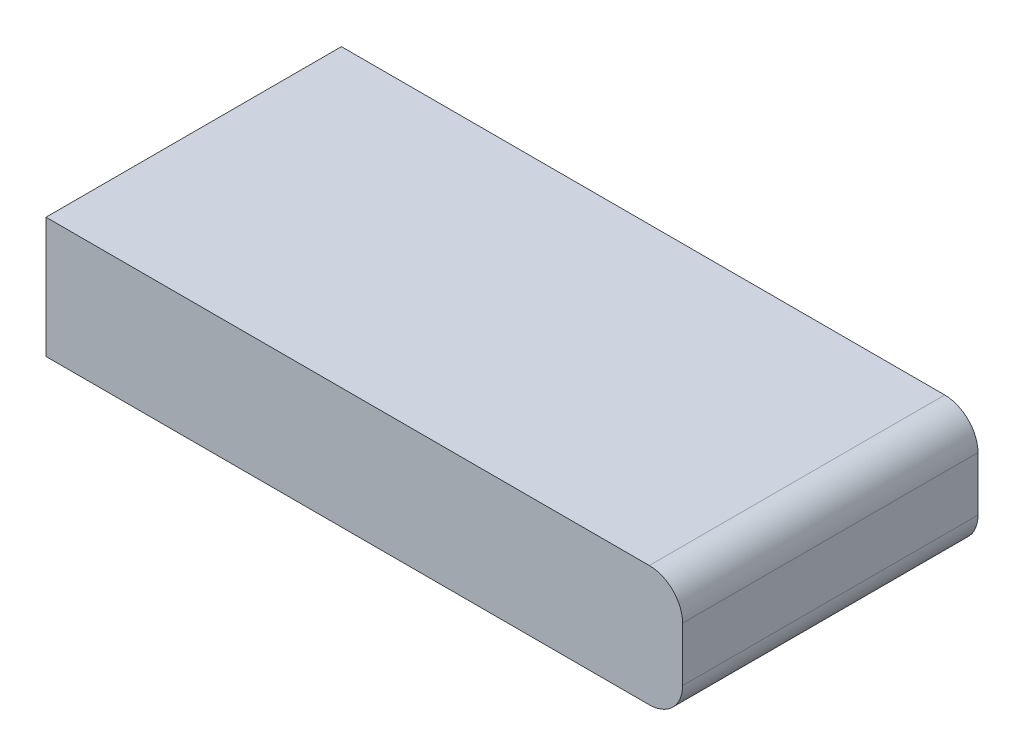
ISO-10303-21;
HEADER;
FILE_DESCRIPTION(('STEP AP214'),'2;1');
FILE_NAME('part.step','',(''),(''),'','','');
FILE_SCHEMA(('AUTOMOTIVE_DESIGN { 1 0 10303 214 1 1 1 1 }'));
ENDSEC;
DATA;
#1=APPLICATION_CONTEXT('core data for automotive mechanical design processes');
#2=APPLICATION_PROTOCOL_DEFINITION('international standard','automotive_design',2000,#1);
#3=PRODUCT_CONTEXT('',#1,'mechanical');
#4=PRODUCT('Part','Part','',(#3));
#5=PRODUCT_RELATED_PRODUCT_CATEGORY('part','',(#4));
#6=PRODUCT_DEFINITION_FORMATION('','',#4);
#7=PRODUCT_DEFINITION_CONTEXT('part definition',#1,'design');
#8=PRODUCT_DEFINITION('design','',#6,#7);
#9=PRODUCT_DEFINITION_SHAPE('','',#8);
#10=(LENGTH_UNIT() NAMED_UNIT(*) SI_UNIT(.MILLI.,.METRE.));
#11=(NAMED_UNIT(*) PLANE_ANGLE_UNIT() SI_UNIT($,.RADIAN.));
#12=(NAMED_UNIT(*) SI_UNIT($,.STERADIAN.) SOLID_ANGLE_UNIT());
#13=UNCERTAINTY_MEASURE_WITH_UNIT(LENGTH_MEASURE(1.E-05),#10,'distance_accuracy_value','');
#14=(GEOMETRIC_REPRESENTATION_CONTEXT(3) GLOBAL_UNCERTAINTY_ASSIGNED_CONTEXT((#13)) GLOBAL_UNIT_ASSIGNED_CONTEXT((#10,
#11,#12)) REPRESENTATION_CONTEXT('',''));
#15=CARTESIAN_POINT('',(0.,0.,0.));
#16=DIRECTION('',(0.,0.,1.));
#17=DIRECTION('',(1.,0.,0.));
#18=AXIS2_PLACEMENT_3D('',#15,#16,#17);
#19=CARTESIAN_POINT('',(68.5,8.,0.));
#20=DIRECTION('',(0.,0.,1.));
#21=DIRECTION('',(1.,0.,0.));
#22=AXIS2_PLACEMENT_3D('',#19,#20,#21);
#23=CYLINDRICAL_SURFACE('',#22,8.);
#24=DIRECTION('',(0.,0.,1.));
#25=VECTOR('',#24,1.);
#26=CARTESIAN_POINT('',(68.5,0.,0.));
#27=LINE('',#26,#25);
#28=CARTESIAN_POINT('',(68.5,0.,-35.5));
#29=VERTEX_POINT('',#28);
#30=CARTESIAN_POINT('',(68.5,0.,35.5));
#31=VERTEX_POINT('',#30);
#32=EDGE_CURVE('E138',#29,#31,#27,.T.);
#33=ORIENTED_EDGE('',*,*,#32,.F.);
#34=CARTESIAN_POINT('',(68.5,8.,-35.5));
#35=DIRECTION('',(0.,0.,1.));
#36=DIRECTION('',(1.,0.,0.));
#37=AXIS2_PLACEMENT_3D('',#34,#35,#36);
#38=CIRCLE('',#37,8.);
#39=CARTESIAN_POINT('',(76.5,8.00000000000001,-35.5));
#40=VERTEX_POINT('',#39);
#41=EDGE_CURVE('E57',#40,#29,#38,.F.);
#42=ORIENTED_EDGE('',*,*,#41,.F.);
#43=DIRECTION('',(0.,0.,1.));
#44=VECTOR('',#43,1.);
#45=CARTESIAN_POINT('',(76.5,8.,35.5));
#46=LINE('',#45,#44);
#47=CARTESIAN_POINT('',(76.5,8.00000000000001,35.5));
#48=VERTEX_POINT('',#47);
#49=EDGE_CURVE('E141',#48,#40,#46,.F.);
#50=ORIENTED_EDGE('',*,*,#49,.F.);
#51=CARTESIAN_POINT('',(68.5,8.,35.5));
#52=DIRECTION('',(0.,0.,-1.));
#53=DIRECTION('',(-1.,0.,0.));
#54=AXIS2_PLACEMENT_3D('',#51,#52,#53);
#55=CIRCLE('',#54,8.);
#56=EDGE_CURVE('E13',#31,#48,#55,.F.);
#57=ORIENTED_EDGE('',*,*,#56,.F.);
#58=EDGE_LOOP('',(#33,#42,#50,#57));
#59=FACE_BOUND('',#58,.T.);
#60=ADVANCED_FACE('F50',(#59),#23,.T.);
#61=CARTESIAN_POINT('',(68.5,21.,35.5));
#62=DIRECTION('',(0.,0.,-1.));
#63=DIRECTION('',(-1.,0.,0.));
#64=AXIS2_PLACEMENT_3D('',#61,#62,#63);
#65=CYLINDRICAL_SURFACE('',#64,8.);
#66=DIRECTION('',(0.,0.,1.));
#67=VECTOR('',#66,1.);
#68=CARTESIAN_POINT('',(76.5,21.,35.5));
#69=LINE('',#68,#67);
#70=CARTESIAN_POINT('',(76.5,21.,-35.5));
#71=VERTEX_POINT('',#70);
#72=CARTESIAN_POINT('',(76.5,21.,35.5));
#73=VERTEX_POINT('',#72);
#74=EDGE_CURVE('E123',#71,#73,#69,.T.);
#75=ORIENTED_EDGE('',*,*,#74,.F.);
#76=CARTESIAN_POINT('',(68.5,21.,-35.5));
#77=DIRECTION('',(0.,0.,1.));
#78=DIRECTION('',(1.,0.,0.));
#79=AXIS2_PLACEMENT_3D('',#76,#77,#78);
#80=CIRCLE('',#79,8.);
#81=CARTESIAN_POINT('',(68.5,29.,-35.5));
#82=VERTEX_POINT('',#81);
#83=EDGE_CURVE('E135',#82,#71,#80,.F.);
#84=ORIENTED_EDGE('',*,*,#83,.F.);
#85=DIRECTION('',(0.,0.,1.));
#86=VECTOR('',#85,1.);
#87=CARTESIAN_POINT('',(68.5,29.,35.5));
#88=LINE('',#87,#86);
#89=CARTESIAN_POINT('',(68.5,29.,35.5));
#90=VERTEX_POINT('',#89);
#91=EDGE_CURVE('E127',#90,#82,#88,.F.);
#92=ORIENTED_EDGE('',*,*,#91,.F.);
#93=CARTESIAN_POINT('',(68.5,21.,35.5));
#94=DIRECTION('',(0.,0.,-1.));
#95=DIRECTION('',(-1.,0.,0.));
#96=AXIS2_PLACEMENT_3D('',#93,#94,#95);
#97=CIRCLE('',#96,8.);
#98=EDGE_CURVE('E105',#73,#90,#97,.F.);
#99=ORIENTED_EDGE('',*,*,#98,.F.);
#100=EDGE_LOOP('',(#75,#84,#92,#99));
#101=FACE_BOUND('',#100,.T.);
#102=ADVANCED_FACE('F158',(#101),#65,.T.);
#103=CARTESIAN_POINT('',(-76.5,29.,35.5));
#104=DIRECTION('',(1.,0.,0.));
#105=DIRECTION('',(0.,0.,-1.));
#106=AXIS2_PLACEMENT_3D('',#103,#104,#105);
#107=PLANE('',#106);
#108=DIRECTION('',(0.,0.,1.));
#109=VECTOR('',#108,1.);
#110=CARTESIAN_POINT('',(-76.5,0.,35.5));
#111=LINE('',#110,#109);
#112=CARTESIAN_POINT('',(-76.5,0.,-35.5));
#113=VERTEX_POINT('',#112);
#114=CARTESIAN_POINT('',(-76.5,0.,35.5));
#115=VERTEX_POINT('',#114);
#116=EDGE_CURVE('E122',#113,#115,#111,.T.);
#117=ORIENTED_EDGE('',*,*,#116,.T.);
#118=DIRECTION('',(0.,-1.,0.));
#119=VECTOR('',#118,1.);
#120=CARTESIAN_POINT('',(-76.5,29.,35.5));
#121=LINE('',#120,#119);
#122=CARTESIAN_POINT('',(-76.5,29.,35.5));
#123=VERTEX_POINT('',#122);
#124=EDGE_CURVE('E103',#123,#115,#121,.T.);
#125=ORIENTED_EDGE('',*,*,#124,.F.);
#126=DIRECTION('',(0.,0.,1.));
#127=VECTOR('',#126,1.);
#128=CARTESIAN_POINT('',(-76.5,29.,35.5));
#129=LINE('',#128,#127);
#130=CARTESIAN_POINT('',(-76.5,29.,-35.5));
#131=VERTEX_POINT('',#130);
#132=EDGE_CURVE('E110',#131,#123,#129,.T.);
#133=ORIENTED_EDGE('',*,*,#132,.F.);
#134=DIRECTION('',(0.,-1.,0.));
#135=VECTOR('',#134,1.);
#136=CARTESIAN_POINT('',(-76.5,29.,-35.5));
#137=LINE('',#136,#135);
#138=EDGE_CURVE('E154',#131,#113,#137,.T.);
#139=ORIENTED_EDGE('',*,*,#138,.T.);
#140=EDGE_LOOP('',(#117,#125,#133,#139));
#141=FACE_BOUND('',#140,.T.);
#142=ADVANCED_FACE('F120',(#141),#107,.F.);
#143=CARTESIAN_POINT('',(76.5,29.,35.5));
#144=DIRECTION('',(0.,0.,-1.));
#145=DIRECTION('',(-1.,0.,0.));
#146=AXIS2_PLACEMENT_3D('',#143,#144,#145);
#147=PLANE('',#146);
#148=DIRECTION('',(1.,0.,0.));
#149=VECTOR('',#148,1.);
#150=CARTESIAN_POINT('',(76.5,0.,35.5));
#151=LINE('',#150,#149);
#152=EDGE_CURVE('E149',#115,#31,#151,.T.);
#153=ORIENTED_EDGE('',*,*,#152,.T.);
#154=ORIENTED_EDGE('',*,*,#56,.T.);
#155=DIRECTION('',(0.,-1.,0.));
#156=VECTOR('',#155,1.);
#157=CARTESIAN_POINT('',(76.5,29.,35.5));
#158=LINE('',#157,#156);
#159=EDGE_CURVE('E124',#73,#48,#158,.T.);
#160=ORIENTED_EDGE('',*,*,#159,.F.);
#161=ORIENTED_EDGE('',*,*,#98,.T.);
#162=DIRECTION('',(1.,0.,0.));
#163=VECTOR('',#162,1.);
#164=CARTESIAN_POINT('',(76.5,29.,35.5));
#165=LINE('',#164,#163);
#166=EDGE_CURVE('E99',#123,#90,#165,.T.);
#167=ORIENTED_EDGE('',*,*,#166,.F.);
#168=ORIENTED_EDGE('',*,*,#124,.T.);
#169=EDGE_LOOP('',(#153,#154,#160,#161,#167,#168));
#170=FACE_BOUND('',#169,.T.);
#171=ADVANCED_FACE('F101',(#170),#147,.F.);
#172=CARTESIAN_POINT('',(76.5,29.,35.5));
#173=DIRECTION('',(-1.,0.,0.));
#174=DIRECTION('',(0.,0.,1.));
#175=AXIS2_PLACEMENT_3D('',#172,#173,#174);
#176=PLANE('',#175);
#177=ORIENTED_EDGE('',*,*,#159,.T.);
#178=ORIENTED_EDGE('',*,*,#49,.T.);
#179=DIRECTION('',(0.,-1.,0.));
#180=VECTOR('',#179,1.);
#181=CARTESIAN_POINT('',(76.5,29.,-35.5));
#182=LINE('',#181,#180);
#183=EDGE_CURVE('E130',#71,#40,#182,.T.);
#184=ORIENTED_EDGE('',*,*,#183,.F.);
#185=ORIENTED_EDGE('',*,*,#74,.T.);
#186=EDGE_LOOP('',(#177,#178,#184,#185));
#187=FACE_BOUND('',#186,.T.);
#188=ADVANCED_FACE('F160',(#187),#176,.F.);
#189=CARTESIAN_POINT('',(76.5,29.,-35.5));
#190=DIRECTION('',(0.,0.,1.));
#191=DIRECTION('',(1.,0.,0.));
#192=AXIS2_PLACEMENT_3D('',#189,#190,#191);
#193=PLANE('',#192);
#194=ORIENTED_EDGE('',*,*,#183,.T.);
#195=ORIENTED_EDGE('',*,*,#41,.T.);
#196=DIRECTION('',(-1.,0.,0.));
#197=VECTOR('',#196,1.);
#198=CARTESIAN_POINT('',(76.5,0.,-35.5));
#199=LINE('',#198,#197);
#200=EDGE_CURVE('E118',#29,#113,#199,.T.);
#201=ORIENTED_EDGE('',*,*,#200,.T.);
#202=ORIENTED_EDGE('',*,*,#138,.F.);
#203=DIRECTION('',(-1.,0.,0.));
#204=VECTOR('',#203,1.);
#205=CARTESIAN_POINT('',(76.5,29.,-35.5));
#206=LINE('',#205,#204);
#207=EDGE_CURVE('E109',#82,#131,#206,.T.);
#208=ORIENTED_EDGE('',*,*,#207,.F.);
#209=ORIENTED_EDGE('',*,*,#83,.T.);
#210=EDGE_LOOP('',(#194,#195,#201,#202,#208,#209));
#211=FACE_BOUND('',#210,.T.);
#212=ADVANCED_FACE('F144',(#211),#193,.F.);
#213=CARTESIAN_POINT('',(0.,29.,0.));
#214=DIRECTION('',(0.,1.,0.));
#215=DIRECTION('',(0.,0.,1.));
#216=AXIS2_PLACEMENT_3D('',#213,#214,#215);
#217=PLANE('',#216);
#218=ORIENTED_EDGE('',*,*,#166,.T.);
#219=ORIENTED_EDGE('',*,*,#91,.T.);
#220=ORIENTED_EDGE('',*,*,#207,.T.);
#221=ORIENTED_EDGE('',*,*,#132,.T.);
#222=EDGE_LOOP('',(#218,#219,#220,#221));
#223=FACE_BOUND('',#222,.T.);
#224=ADVANCED_FACE('F113',(#223),#217,.T.);
#225=CARTESIAN_POINT('',(0.,0.,0.));
#226=DIRECTION('',(0.,1.,0.));
#227=DIRECTION('',(0.,0.,1.));
#228=AXIS2_PLACEMENT_3D('',#225,#226,#227);
#229=PLANE('',#228);
#230=ORIENTED_EDGE('',*,*,#200,.F.);
#231=ORIENTED_EDGE('',*,*,#32,.T.);
#232=ORIENTED_EDGE('',*,*,#152,.F.);
#233=ORIENTED_EDGE('',*,*,#116,.F.);
#234=EDGE_LOOP('',(#230,#231,#232,#233));
#235=FACE_BOUND('',#234,.T.);
#236=ADVANCED_FACE('F148',(#235),#229,.F.);
#237=CLOSED_SHELL('',(#60,#102,#142,#171,#188,#212,#224,#236));
#238=MANIFOLD_SOLID_BREP('B2',#237);
#239=ADVANCED_BREP_SHAPE_REPRESENTATION('',(#18,#238),#14);
#240=SHAPE_DEFINITION_REPRESENTATION(#9,#239);
ENDSEC;
END-ISO-10303-21;
